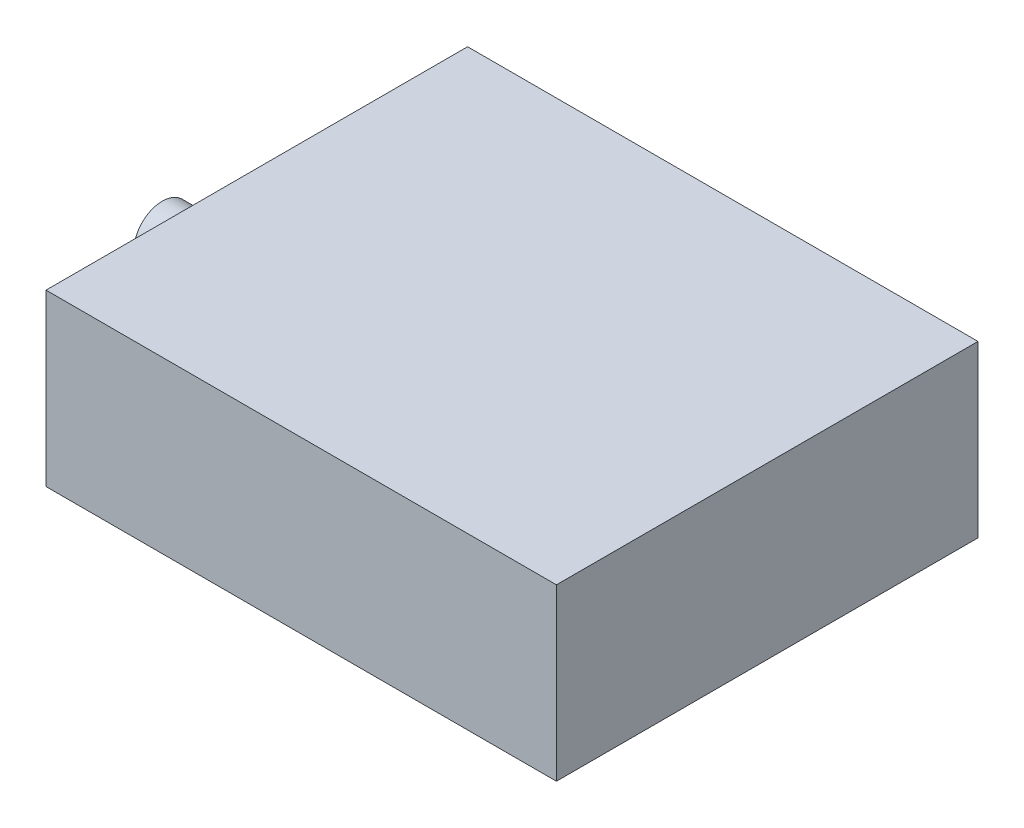
ISO-10303-21;
HEADER;
FILE_DESCRIPTION(('STEP AP214'),'2;1');
FILE_NAME('part.step','',(''),(''),'','','');
FILE_SCHEMA(('AUTOMOTIVE_DESIGN { 1 0 10303 214 1 1 1 1 }'));
ENDSEC;
DATA;
#1=APPLICATION_CONTEXT('core data for automotive mechanical design processes');
#2=APPLICATION_PROTOCOL_DEFINITION('international standard','automotive_design',2000,#1);
#3=PRODUCT_CONTEXT('',#1,'mechanical');
#4=PRODUCT('Part','Part','',(#3));
#5=PRODUCT_RELATED_PRODUCT_CATEGORY('part','',(#4));
#6=PRODUCT_DEFINITION_FORMATION('','',#4);
#7=PRODUCT_DEFINITION_CONTEXT('part definition',#1,'design');
#8=PRODUCT_DEFINITION('design','',#6,#7);
#9=PRODUCT_DEFINITION_SHAPE('','',#8);
#10=(LENGTH_UNIT() NAMED_UNIT(*) SI_UNIT(.MILLI.,.METRE.));
#11=(NAMED_UNIT(*) PLANE_ANGLE_UNIT() SI_UNIT($,.RADIAN.));
#12=(NAMED_UNIT(*) SI_UNIT($,.STERADIAN.) SOLID_ANGLE_UNIT());
#13=UNCERTAINTY_MEASURE_WITH_UNIT(LENGTH_MEASURE(1.E-05),#10,'distance_accuracy_value','');
#14=(GEOMETRIC_REPRESENTATION_CONTEXT(3) GLOBAL_UNCERTAINTY_ASSIGNED_CONTEXT((#13)) GLOBAL_UNIT_ASSIGNED_CONTEXT((#10,
#11,#12)) REPRESENTATION_CONTEXT('',''));
#15=CARTESIAN_POINT('',(0.,0.,0.));
#16=DIRECTION('',(0.,0.,1.));
#17=DIRECTION('',(1.,0.,0.));
#18=AXIS2_PLACEMENT_3D('',#15,#16,#17);
#19=CARTESIAN_POINT('',(13.5,9.,11.15));
#20=DIRECTION('',(-1.,0.,0.));
#21=DIRECTION('',(0.,0.,1.));
#22=AXIS2_PLACEMENT_3D('',#19,#20,#21);
#23=PLANE('',#22);
#24=DIRECTION('',(0.,0.,-1.));
#25=VECTOR('',#24,1.);
#26=CARTESIAN_POINT('',(13.5,0.,11.15));
#27=LINE('',#26,#25);
#28=CARTESIAN_POINT('',(13.5,0.,11.15));
#29=VERTEX_POINT('',#28);
#30=CARTESIAN_POINT('',(13.5,0.,-11.15));
#31=VERTEX_POINT('',#30);
#32=EDGE_CURVE('E105',#29,#31,#27,.T.);
#33=ORIENTED_EDGE('',*,*,#32,.T.);
#34=DIRECTION('',(0.,-1.,0.));
#35=VECTOR('',#34,1.);
#36=CARTESIAN_POINT('',(13.5,9.,-11.15));
#37=LINE('',#36,#35);
#38=CARTESIAN_POINT('',(13.5,9.,-11.15));
#39=VERTEX_POINT('',#38);
#40=EDGE_CURVE('E47',#39,#31,#37,.T.);
#41=ORIENTED_EDGE('',*,*,#40,.F.);
#42=DIRECTION('',(0.,0.,-1.));
#43=VECTOR('',#42,1.);
#44=CARTESIAN_POINT('',(13.5,9.,11.15));
#45=LINE('',#44,#43);
#46=CARTESIAN_POINT('',(13.5,9.,11.15));
#47=VERTEX_POINT('',#46);
#48=EDGE_CURVE('E91',#47,#39,#45,.T.);
#49=ORIENTED_EDGE('',*,*,#48,.F.);
#50=DIRECTION('',(0.,-1.,0.));
#51=VECTOR('',#50,1.);
#52=CARTESIAN_POINT('',(13.5,9.,11.15));
#53=LINE('',#52,#51);
#54=EDGE_CURVE('E101',#47,#29,#53,.T.);
#55=ORIENTED_EDGE('',*,*,#54,.T.);
#56=EDGE_LOOP('',(#33,#41,#49,#55));
#57=FACE_BOUND('',#56,.T.);
#58=ADVANCED_FACE('F39',(#57),#23,.F.);
#59=CARTESIAN_POINT('',(-13.5,9.,-11.15));
#60=DIRECTION('',(0.,0.,1.));
#61=DIRECTION('',(1.,0.,0.));
#62=AXIS2_PLACEMENT_3D('',#59,#60,#61);
#63=PLANE('',#62);
#64=DIRECTION('',(-1.,0.,0.));
#65=VECTOR('',#64,1.);
#66=CARTESIAN_POINT('',(-13.5,0.,-11.15));
#67=LINE('',#66,#65);
#68=CARTESIAN_POINT('',(-13.5,0.,-11.15));
#69=VERTEX_POINT('',#68);
#70=EDGE_CURVE('E96',#31,#69,#67,.T.);
#71=ORIENTED_EDGE('',*,*,#70,.T.);
#72=DIRECTION('',(0.,-1.,0.));
#73=VECTOR('',#72,1.);
#74=CARTESIAN_POINT('',(-13.5,9.,-11.15));
#75=LINE('',#74,#73);
#76=CARTESIAN_POINT('',(-13.5,9.,-11.15));
#77=VERTEX_POINT('',#76);
#78=EDGE_CURVE('E94',#77,#69,#75,.T.);
#79=ORIENTED_EDGE('',*,*,#78,.F.);
#80=DIRECTION('',(-1.,0.,0.));
#81=VECTOR('',#80,1.);
#82=CARTESIAN_POINT('',(-13.5,9.,-11.15));
#83=LINE('',#82,#81);
#84=EDGE_CURVE('E86',#39,#77,#83,.T.);
#85=ORIENTED_EDGE('',*,*,#84,.F.);
#86=ORIENTED_EDGE('',*,*,#40,.T.);
#87=EDGE_LOOP('',(#71,#79,#85,#86));
#88=FACE_BOUND('',#87,.T.);
#89=ADVANCED_FACE('F95',(#88),#63,.F.);
#90=CARTESIAN_POINT('',(-13.5,9.,11.15));
#91=DIRECTION('',(1.,0.,0.));
#92=DIRECTION('',(0.,0.,-1.));
#93=AXIS2_PLACEMENT_3D('',#90,#91,#92);
#94=PLANE('',#93);
#95=CARTESIAN_POINT('',(-13.5,3.5,0.));
#96=DIRECTION('',(1.,0.,0.));
#97=DIRECTION('',(0.,0.,-1.));
#98=AXIS2_PLACEMENT_3D('',#95,#96,#97);
#99=CIRCLE('',#98,1.5);
#100=CARTESIAN_POINT('',(-13.5,3.5,-1.5));
#101=VERTEX_POINT('',#100);
#102=EDGE_CURVE('E11',#101,#101,#99,.F.);
#103=ORIENTED_EDGE('',*,*,#102,.F.);
#104=EDGE_LOOP('',(#103));
#105=FACE_BOUND('',#104,.T.);
#106=DIRECTION('',(0.,0.,1.));
#107=VECTOR('',#106,1.);
#108=CARTESIAN_POINT('',(-13.5,0.,11.15));
#109=LINE('',#108,#107);
#110=CARTESIAN_POINT('',(-13.5,0.,11.15));
#111=VERTEX_POINT('',#110);
#112=EDGE_CURVE('E72',#69,#111,#109,.T.);
#113=ORIENTED_EDGE('',*,*,#112,.T.);
#114=DIRECTION('',(0.,-1.,0.));
#115=VECTOR('',#114,1.);
#116=CARTESIAN_POINT('',(-13.5,9.,11.15));
#117=LINE('',#116,#115);
#118=CARTESIAN_POINT('',(-13.5,9.,11.15));
#119=VERTEX_POINT('',#118);
#120=EDGE_CURVE('E97',#119,#111,#117,.T.);
#121=ORIENTED_EDGE('',*,*,#120,.F.);
#122=DIRECTION('',(0.,0.,1.));
#123=VECTOR('',#122,1.);
#124=CARTESIAN_POINT('',(-13.5,9.,11.15));
#125=LINE('',#124,#123);
#126=EDGE_CURVE('E89',#77,#119,#125,.T.);
#127=ORIENTED_EDGE('',*,*,#126,.F.);
#128=ORIENTED_EDGE('',*,*,#78,.T.);
#129=EDGE_LOOP('',(#113,#121,#127,#128));
#130=FACE_BOUND('',#129,.T.);
#131=ADVANCED_FACE('F99',(#105,#130),#94,.F.);
#132=CARTESIAN_POINT('',(-13.5,9.,11.15));
#133=DIRECTION('',(0.,0.,-1.));
#134=DIRECTION('',(-1.,0.,0.));
#135=AXIS2_PLACEMENT_3D('',#132,#133,#134);
#136=PLANE('',#135);
#137=DIRECTION('',(1.,0.,0.));
#138=VECTOR('',#137,1.);
#139=CARTESIAN_POINT('',(-13.5,0.,11.15));
#140=LINE('',#139,#138);
#141=EDGE_CURVE('E78',#111,#29,#140,.T.);
#142=ORIENTED_EDGE('',*,*,#141,.T.);
#143=ORIENTED_EDGE('',*,*,#54,.F.);
#144=DIRECTION('',(1.,0.,0.));
#145=VECTOR('',#144,1.);
#146=CARTESIAN_POINT('',(-13.5,9.,11.15));
#147=LINE('',#146,#145);
#148=EDGE_CURVE('E55',#119,#47,#147,.T.);
#149=ORIENTED_EDGE('',*,*,#148,.F.);
#150=ORIENTED_EDGE('',*,*,#120,.T.);
#151=EDGE_LOOP('',(#142,#143,#149,#150));
#152=FACE_BOUND('',#151,.T.);
#153=ADVANCED_FACE('F127',(#152),#136,.F.);
#154=CARTESIAN_POINT('',(0.,9.,0.));
#155=DIRECTION('',(0.,-1.,0.));
#156=DIRECTION('',(0.,0.,-1.));
#157=AXIS2_PLACEMENT_3D('',#154,#155,#156);
#158=PLANE('',#157);
#159=ORIENTED_EDGE('',*,*,#48,.T.);
#160=ORIENTED_EDGE('',*,*,#84,.T.);
#161=ORIENTED_EDGE('',*,*,#126,.T.);
#162=ORIENTED_EDGE('',*,*,#148,.T.);
#163=EDGE_LOOP('',(#159,#160,#161,#162));
#164=FACE_BOUND('',#163,.T.);
#165=ADVANCED_FACE('F87',(#164),#158,.F.);
#166=CARTESIAN_POINT('',(0.,0.,0.));
#167=DIRECTION('',(0.,-1.,0.));
#168=DIRECTION('',(0.,0.,-1.));
#169=AXIS2_PLACEMENT_3D('',#166,#167,#168);
#170=PLANE('',#169);
#171=ORIENTED_EDGE('',*,*,#32,.F.);
#172=ORIENTED_EDGE('',*,*,#141,.F.);
#173=ORIENTED_EDGE('',*,*,#112,.F.);
#174=ORIENTED_EDGE('',*,*,#70,.F.);
#175=EDGE_LOOP('',(#171,#172,#173,#174));
#176=FACE_BOUND('',#175,.T.);
#177=ADVANCED_FACE('F116',(#176),#170,.T.);
#178=CARTESIAN_POINT('',(-18.5,3.5,0.));
#179=DIRECTION('',(1.,0.,0.));
#180=DIRECTION('',(0.,0.,-1.));
#181=AXIS2_PLACEMENT_3D('',#178,#179,#180);
#182=CYLINDRICAL_SURFACE('',#181,1.5);
#183=CARTESIAN_POINT('',(-18.5,3.5,0.));
#184=DIRECTION('',(-1.,0.,0.));
#185=DIRECTION('',(0.,0.,1.));
#186=AXIS2_PLACEMENT_3D('',#183,#184,#185);
#187=CIRCLE('',#186,1.5);
#188=CARTESIAN_POINT('',(-18.5,3.5,1.5));
#189=VERTEX_POINT('',#188);
#190=EDGE_CURVE('E108',#189,#189,#187,.T.);
#191=ORIENTED_EDGE('',*,*,#190,.F.);
#192=EDGE_LOOP('',(#191));
#193=FACE_BOUND('',#192,.T.);
#194=ORIENTED_EDGE('',*,*,#102,.T.);
#195=EDGE_LOOP('',(#194));
#196=FACE_BOUND('',#195,.T.);
#197=ADVANCED_FACE('F118',(#193,#196),#182,.T.);
#198=CARTESIAN_POINT('',(-18.5,3.5,0.));
#199=DIRECTION('',(-1.,0.,0.));
#200=DIRECTION('',(0.,0.,1.));
#201=AXIS2_PLACEMENT_3D('',#198,#199,#200);
#202=PLANE('',#201);
#203=ORIENTED_EDGE('',*,*,#190,.T.);
#204=EDGE_LOOP('',(#203));
#205=FACE_BOUND('',#204,.T.);
#206=ADVANCED_FACE('F124',(#205),#202,.T.);
#207=CLOSED_SHELL('',(#58,#89,#131,#153,#165,#177,#197,#206));
#208=MANIFOLD_SOLID_BREP('B2',#207);
#209=ADVANCED_BREP_SHAPE_REPRESENTATION('',(#18,#208),#14);
#210=SHAPE_DEFINITION_REPRESENTATION(#9,#209);
ENDSEC;
END-ISO-10303-21;
